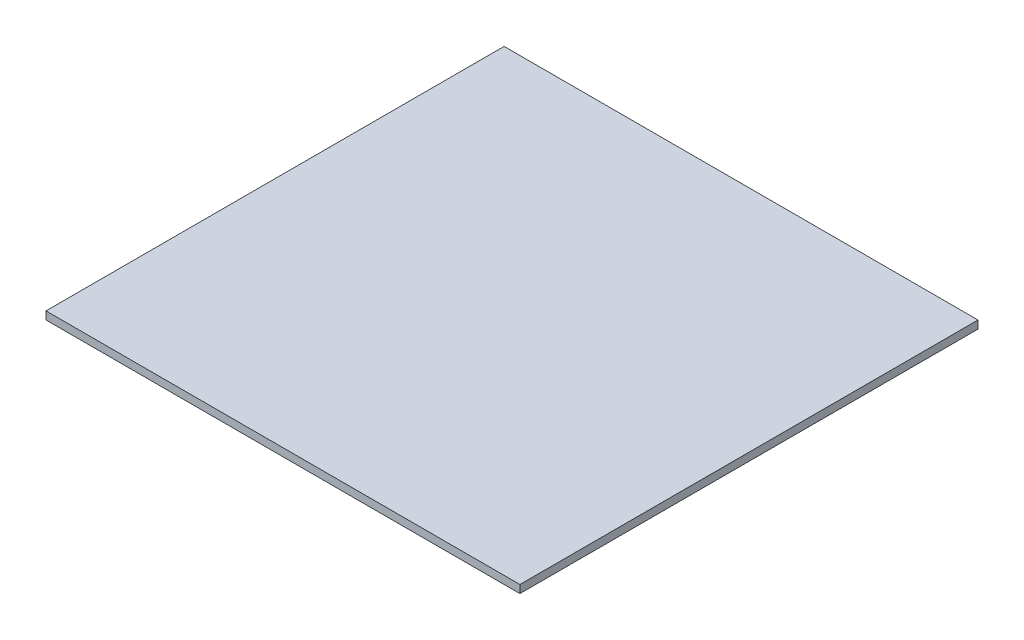
ISO-10303-21;
HEADER;
FILE_DESCRIPTION(('STEP AP214'),'2;1');
FILE_NAME('part.step','',(''),(''),'','','');
FILE_SCHEMA(('AUTOMOTIVE_DESIGN { 1 0 10303 214 1 1 1 1 }'));
ENDSEC;
DATA;
#1=APPLICATION_CONTEXT('core data for automotive mechanical design processes');
#2=APPLICATION_PROTOCOL_DEFINITION('international standard','automotive_design',2000,#1);
#3=PRODUCT_CONTEXT('',#1,'mechanical');
#4=PRODUCT('Part','Part','',(#3));
#5=PRODUCT_RELATED_PRODUCT_CATEGORY('part','',(#4));
#6=PRODUCT_DEFINITION_FORMATION('','',#4);
#7=PRODUCT_DEFINITION_CONTEXT('part definition',#1,'design');
#8=PRODUCT_DEFINITION('design','',#6,#7);
#9=PRODUCT_DEFINITION_SHAPE('','',#8);
#10=(LENGTH_UNIT() NAMED_UNIT(*) SI_UNIT(.MILLI.,.METRE.));
#11=(NAMED_UNIT(*) PLANE_ANGLE_UNIT() SI_UNIT($,.RADIAN.));
#12=(NAMED_UNIT(*) SI_UNIT($,.STERADIAN.) SOLID_ANGLE_UNIT());
#13=UNCERTAINTY_MEASURE_WITH_UNIT(LENGTH_MEASURE(1.E-05),#10,'distance_accuracy_value','');
#14=(GEOMETRIC_REPRESENTATION_CONTEXT(3) GLOBAL_UNCERTAINTY_ASSIGNED_CONTEXT((#13)) GLOBAL_UNIT_ASSIGNED_CONTEXT((#10,
#11,#12)) REPRESENTATION_CONTEXT('',''));
#15=CARTESIAN_POINT('',(0.,0.,0.));
#16=DIRECTION('',(0.,0.,1.));
#17=DIRECTION('',(1.,0.,0.));
#18=AXIS2_PLACEMENT_3D('',#15,#16,#17);
#19=CARTESIAN_POINT('',(0.,12.7,0.));
#20=DIRECTION('',(1.,0.,0.));
#21=DIRECTION('',(0.,0.,-1.));
#22=AXIS2_PLACEMENT_3D('',#19,#20,#21);
#23=PLANE('',#22);
#24=DIRECTION('',(0.,0.,1.));
#25=VECTOR('',#24,1.);
#26=CARTESIAN_POINT('',(0.,0.,0.));
#27=LINE('',#26,#25);
#28=CARTESIAN_POINT('',(0.,0.,-736.6));
#29=VERTEX_POINT('',#28);
#30=CARTESIAN_POINT('',(0.,0.,0.));
#31=VERTEX_POINT('',#30);
#32=EDGE_CURVE('E107',#29,#31,#27,.T.);
#33=ORIENTED_EDGE('',*,*,#32,.T.);
#34=DIRECTION('',(0.,-1.,0.));
#35=VECTOR('',#34,1.);
#36=CARTESIAN_POINT('',(0.,12.7,0.));
#37=LINE('',#36,#35);
#38=CARTESIAN_POINT('',(0.,12.7,0.));
#39=VERTEX_POINT('',#38);
#40=EDGE_CURVE('E11',#39,#31,#37,.T.);
#41=ORIENTED_EDGE('',*,*,#40,.F.);
#42=DIRECTION('',(0.,0.,1.));
#43=VECTOR('',#42,1.);
#44=CARTESIAN_POINT('',(0.,12.7,0.));
#45=LINE('',#44,#43);
#46=CARTESIAN_POINT('',(0.,12.7,-736.6));
#47=VERTEX_POINT('',#46);
#48=EDGE_CURVE('E91',#47,#39,#45,.T.);
#49=ORIENTED_EDGE('',*,*,#48,.F.);
#50=DIRECTION('',(0.,-1.,0.));
#51=VECTOR('',#50,1.);
#52=CARTESIAN_POINT('',(0.,12.7,-736.6));
#53=LINE('',#52,#51);
#54=EDGE_CURVE('E103',#47,#29,#53,.T.);
#55=ORIENTED_EDGE('',*,*,#54,.T.);
#56=EDGE_LOOP('',(#33,#41,#49,#55));
#57=FACE_BOUND('',#56,.T.);
#58=ADVANCED_FACE('F39',(#57),#23,.F.);
#59=CARTESIAN_POINT('',(0.,12.7,0.));
#60=DIRECTION('',(0.,0.,-1.));
#61=DIRECTION('',(-1.,0.,0.));
#62=AXIS2_PLACEMENT_3D('',#59,#60,#61);
#63=PLANE('',#62);
#64=DIRECTION('',(1.,0.,0.));
#65=VECTOR('',#64,1.);
#66=CARTESIAN_POINT('',(0.,0.,0.));
#67=LINE('',#66,#65);
#68=CARTESIAN_POINT('',(762.,0.,0.));
#69=VERTEX_POINT('',#68);
#70=EDGE_CURVE('E96',#31,#69,#67,.T.);
#71=ORIENTED_EDGE('',*,*,#70,.T.);
#72=DIRECTION('',(0.,-1.,0.));
#73=VECTOR('',#72,1.);
#74=CARTESIAN_POINT('',(762.,12.7,0.));
#75=LINE('',#74,#73);
#76=CARTESIAN_POINT('',(762.,12.7,0.));
#77=VERTEX_POINT('',#76);
#78=EDGE_CURVE('E48',#77,#69,#75,.T.);
#79=ORIENTED_EDGE('',*,*,#78,.F.);
#80=DIRECTION('',(1.,0.,0.));
#81=VECTOR('',#80,1.);
#82=CARTESIAN_POINT('',(0.,12.7,0.));
#83=LINE('',#82,#81);
#84=EDGE_CURVE('E86',#39,#77,#83,.T.);
#85=ORIENTED_EDGE('',*,*,#84,.F.);
#86=ORIENTED_EDGE('',*,*,#40,.T.);
#87=EDGE_LOOP('',(#71,#79,#85,#86));
#88=FACE_BOUND('',#87,.T.);
#89=ADVANCED_FACE('F95',(#88),#63,.F.);
#90=CARTESIAN_POINT('',(762.,12.7,0.));
#91=DIRECTION('',(-1.,0.,0.));
#92=DIRECTION('',(0.,0.,1.));
#93=AXIS2_PLACEMENT_3D('',#90,#91,#92);
#94=PLANE('',#93);
#95=DIRECTION('',(0.,0.,-1.));
#96=VECTOR('',#95,1.);
#97=CARTESIAN_POINT('',(762.,0.,0.));
#98=LINE('',#97,#96);
#99=CARTESIAN_POINT('',(762.,0.,-736.6));
#100=VERTEX_POINT('',#99);
#101=EDGE_CURVE('E73',#69,#100,#98,.T.);
#102=ORIENTED_EDGE('',*,*,#101,.T.);
#103=DIRECTION('',(0.,-1.,0.));
#104=VECTOR('',#103,1.);
#105=CARTESIAN_POINT('',(762.,12.7,-736.6));
#106=LINE('',#105,#104);
#107=CARTESIAN_POINT('',(762.,12.7,-736.6));
#108=VERTEX_POINT('',#107);
#109=EDGE_CURVE('E98',#108,#100,#106,.T.);
#110=ORIENTED_EDGE('',*,*,#109,.F.);
#111=DIRECTION('',(0.,0.,-1.));
#112=VECTOR('',#111,1.);
#113=CARTESIAN_POINT('',(762.,12.7,0.));
#114=LINE('',#113,#112);
#115=EDGE_CURVE('E89',#77,#108,#114,.T.);
#116=ORIENTED_EDGE('',*,*,#115,.F.);
#117=ORIENTED_EDGE('',*,*,#78,.T.);
#118=EDGE_LOOP('',(#102,#110,#116,#117));
#119=FACE_BOUND('',#118,.T.);
#120=ADVANCED_FACE('F99',(#119),#94,.F.);
#121=CARTESIAN_POINT('',(0.,12.7,-736.6));
#122=DIRECTION('',(0.,0.,1.));
#123=DIRECTION('',(1.,0.,0.));
#124=AXIS2_PLACEMENT_3D('',#121,#122,#123);
#125=PLANE('',#124);
#126=DIRECTION('',(-1.,0.,0.));
#127=VECTOR('',#126,1.);
#128=CARTESIAN_POINT('',(0.,0.,-736.6));
#129=LINE('',#128,#127);
#130=EDGE_CURVE('E79',#100,#29,#129,.T.);
#131=ORIENTED_EDGE('',*,*,#130,.T.);
#132=ORIENTED_EDGE('',*,*,#54,.F.);
#133=DIRECTION('',(-1.,0.,0.));
#134=VECTOR('',#133,1.);
#135=CARTESIAN_POINT('',(0.,12.7,-736.6));
#136=LINE('',#135,#134);
#137=EDGE_CURVE('E56',#108,#47,#136,.T.);
#138=ORIENTED_EDGE('',*,*,#137,.F.);
#139=ORIENTED_EDGE('',*,*,#109,.T.);
#140=EDGE_LOOP('',(#131,#132,#138,#139));
#141=FACE_BOUND('',#140,.T.);
#142=ADVANCED_FACE('F120',(#141),#125,.F.);
#143=CARTESIAN_POINT('',(0.,12.7,0.));
#144=DIRECTION('',(0.,-1.,0.));
#145=DIRECTION('',(0.,0.,-1.));
#146=AXIS2_PLACEMENT_3D('',#143,#144,#145);
#147=PLANE('',#146);
#148=ORIENTED_EDGE('',*,*,#48,.T.);
#149=ORIENTED_EDGE('',*,*,#84,.T.);
#150=ORIENTED_EDGE('',*,*,#115,.T.);
#151=ORIENTED_EDGE('',*,*,#137,.T.);
#152=EDGE_LOOP('',(#148,#149,#150,#151));
#153=FACE_BOUND('',#152,.T.);
#154=ADVANCED_FACE('F87',(#153),#147,.F.);
#155=CARTESIAN_POINT('',(0.,0.,0.));
#156=DIRECTION('',(0.,-1.,0.));
#157=DIRECTION('',(0.,0.,-1.));
#158=AXIS2_PLACEMENT_3D('',#155,#156,#157);
#159=PLANE('',#158);
#160=ORIENTED_EDGE('',*,*,#32,.F.);
#161=ORIENTED_EDGE('',*,*,#130,.F.);
#162=ORIENTED_EDGE('',*,*,#101,.F.);
#163=ORIENTED_EDGE('',*,*,#70,.F.);
#164=EDGE_LOOP('',(#160,#161,#162,#163));
#165=FACE_BOUND('',#164,.T.);
#166=ADVANCED_FACE('F123',(#165),#159,.T.);
#167=CLOSED_SHELL('',(#58,#89,#120,#142,#154,#166));
#168=MANIFOLD_SOLID_BREP('B2',#167);
#169=ADVANCED_BREP_SHAPE_REPRESENTATION('',(#18,#168),#14);
#170=SHAPE_DEFINITION_REPRESENTATION(#9,#169);
ENDSEC;
END-ISO-10303-21;
